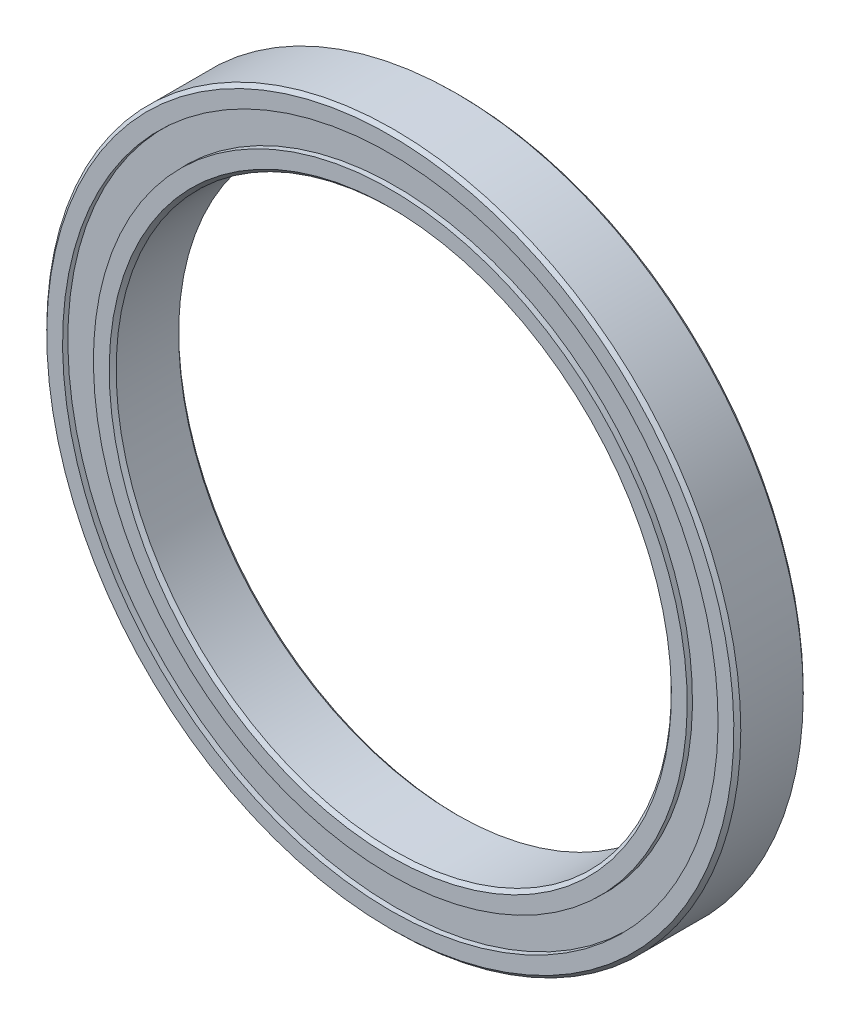
ISO-10303-21;
HEADER;
FILE_DESCRIPTION(('STEP AP214'),'2;1');
FILE_NAME('part.step','',(''),(''),'','','');
FILE_SCHEMA(('AUTOMOTIVE_DESIGN { 1 0 10303 214 1 1 1 1 }'));
ENDSEC;
DATA;
#1=APPLICATION_CONTEXT('core data for automotive mechanical design processes');
#2=APPLICATION_PROTOCOL_DEFINITION('international standard','automotive_design',2000,#1);
#3=PRODUCT_CONTEXT('',#1,'mechanical');
#4=PRODUCT('Part','Part','',(#3));
#5=PRODUCT_RELATED_PRODUCT_CATEGORY('part','',(#4));
#6=PRODUCT_DEFINITION_FORMATION('','',#4);
#7=PRODUCT_DEFINITION_CONTEXT('part definition',#1,'design');
#8=PRODUCT_DEFINITION('design','',#6,#7);
#9=PRODUCT_DEFINITION_SHAPE('','',#8);
#10=(LENGTH_UNIT() NAMED_UNIT(*) SI_UNIT(.MILLI.,.METRE.));
#11=(NAMED_UNIT(*) PLANE_ANGLE_UNIT() SI_UNIT($,.RADIAN.));
#12=(NAMED_UNIT(*) SI_UNIT($,.STERADIAN.) SOLID_ANGLE_UNIT());
#13=UNCERTAINTY_MEASURE_WITH_UNIT(LENGTH_MEASURE(1.E-05),#10,'distance_accuracy_value','');
#14=(GEOMETRIC_REPRESENTATION_CONTEXT(3) GLOBAL_UNCERTAINTY_ASSIGNED_CONTEXT((#13)) GLOBAL_UNIT_ASSIGNED_CONTEXT((#10,
#11,#12)) REPRESENTATION_CONTEXT('',''));
#15=CARTESIAN_POINT('',(0.,0.,0.));
#16=DIRECTION('',(0.,0.,1.));
#17=DIRECTION('',(1.,0.,0.));
#18=AXIS2_PLACEMENT_3D('',#15,#16,#17);
#19=CARTESIAN_POINT('',(10.3777141834092,43.7870191760922,0.));
#20=DIRECTION('',(0.,0.,1.));
#21=DIRECTION('',(0.230615870742427,0.973044870579827,0.));
#22=AXIS2_PLACEMENT_3D('',#19,#20,#21);
#23=SPHERICAL_SURFACE('',#22,3.14269680527354);
#24=CARTESIAN_POINT('',(10.3777141834092,43.7870191760922,3.14269680527354));
#25=VERTEX_POINT('',#24);
#26=VERTEX_LOOP('',#25);
#27=FACE_BOUND('',#26,.T.);
#28=ADVANCED_FACE('F44',(#27),#23,.T.);
#29=CLOSED_SHELL('',(#28));
#30=MANIFOLD_SOLID_BREP('B2',#29);
#31=CARTESIAN_POINT('',(20.1959631090203,40.2134688145538,0.));
#32=DIRECTION('',(0.,0.,1.));
#33=DIRECTION('',(0.448799180200451,0.893632640323418,0.));
#34=AXIS2_PLACEMENT_3D('',#31,#32,#33);
#35=SPHERICAL_SURFACE('',#34,3.14269680527354);
#36=CARTESIAN_POINT('',(20.1959631090203,40.2134688145538,3.14269680527354));
#37=VERTEX_POINT('',#36);
#38=VERTEX_LOOP('',#37);
#39=FACE_BOUND('',#38,.T.);
#40=ADVANCED_FACE('F65',(#39),#35,.T.);
#41=CLOSED_SHELL('',(#40));
#42=MANIFOLD_SOLID_BREP('B6',#41);
#43=CARTESIAN_POINT('',(28.9254424358938,34.4719999403544,0.));
#44=DIRECTION('',(0.,0.,1.));
#45=DIRECTION('',(0.642787609686529,0.766044443118986,0.));
#46=AXIS2_PLACEMENT_3D('',#43,#44,#45);
#47=SPHERICAL_SURFACE('',#46,3.14269680527354);
#48=CARTESIAN_POINT('',(28.9254424358938,34.4719999403544,3.14269680527354));
#49=VERTEX_POINT('',#48);
#50=VERTEX_LOOP('',#49);
#51=FACE_BOUND('',#50,.T.);
#52=ADVANCED_FACE('F86',(#51),#47,.T.);
#53=CLOSED_SHELL('',(#52));
#54=MANIFOLD_SOLID_BREP('B40',#53);
#55=CARTESIAN_POINT('',(36.0955436739766,26.8721366266258,0.));
#56=DIRECTION('',(0.,0.,1.));
#57=DIRECTION('',(0.802123192755037,0.597158591702796,0.));
#58=AXIS2_PLACEMENT_3D('',#55,#56,#57);
#59=SPHERICAL_SURFACE('',#58,3.14269680527354);
#60=CARTESIAN_POINT('',(36.0955436739766,26.8721366266258,3.14269680527354));
#61=VERTEX_POINT('',#60);
#62=VERTEX_LOOP('',#61);
#63=FACE_BOUND('',#62,.T.);
#64=ADVANCED_FACE('F107',(#63),#59,.T.);
#65=CLOSED_SHELL('',(#64));
#66=MANIFOLD_SOLID_BREP('B61',#65);
#67=CARTESIAN_POINT('',(41.3197248096121,17.8235894717625,0.));
#68=DIRECTION('',(0.,0.,1.));
#69=DIRECTION('',(0.91821610688027,0.396079766039167,0.));
#70=AXIS2_PLACEMENT_3D('',#67,#68,#69);
#71=SPHERICAL_SURFACE('',#70,3.14269680527354);
#72=CARTESIAN_POINT('',(41.3197248096121,17.8235894717625,3.14269680527354));
#73=VERTEX_POINT('',#72);
#74=VERTEX_LOOP('',#73);
#75=FACE_BOUND('',#74,.T.);
#76=ADVANCED_FACE('F128',(#75),#71,.T.);
#77=CLOSED_SHELL('',(#76));
#78=MANIFOLD_SOLID_BREP('B82',#77);
#79=CARTESIAN_POINT('',(44.3163488855493,7.81416799501236,0.));
#80=DIRECTION('',(0.,0.,1.));
#81=DIRECTION('',(0.984807753012206,0.173648177666941,0.));
#82=AXIS2_PLACEMENT_3D('',#79,#80,#81);
#83=SPHERICAL_SURFACE('',#82,3.14269680527354);
#84=CARTESIAN_POINT('',(44.3163488855493,7.81416799501236,3.14269680527354));
#85=VERTEX_POINT('',#84);
#86=VERTEX_LOOP('',#85);
#87=FACE_BOUND('',#86,.T.);
#88=ADVANCED_FACE('F149',(#87),#83,.T.);
#89=CLOSED_SHELL('',(#88));
#90=MANIFOLD_SOLID_BREP('B103',#89);
#91=CARTESIAN_POINT('',(44.9238671222071,-2.61651730097095,0.));
#92=DIRECTION('',(0.,0.,1.));
#93=DIRECTION('',(0.998308158271269,-0.0581448289104656,0.));
#94=AXIS2_PLACEMENT_3D('',#91,#92,#93);
#95=SPHERICAL_SURFACE('',#94,3.14269680527354);
#96=CARTESIAN_POINT('',(44.9238671222071,-2.61651730097095,3.14269680527354));
#97=VERTEX_POINT('',#96);
#98=VERTEX_LOOP('',#97);
#99=FACE_BOUND('',#98,.T.);
#100=ADVANCED_FACE('F170',(#99),#95,.T.);
#101=CLOSED_SHELL('',(#100));
#102=MANIFOLD_SOLID_BREP('B124',#101);
#103=CARTESIAN_POINT('',(43.1095280541971,-12.9061454719986,0.));
#104=DIRECTION('',(0.,0.,1.));
#105=DIRECTION('',(0.957989512315492,-0.28680323271108,0.));
#106=AXIS2_PLACEMENT_3D('',#103,#104,#105);
#107=SPHERICAL_SURFACE('',#106,3.14269680527354);
#108=CARTESIAN_POINT('',(43.1095280541971,-12.9061454719986,3.14269680527354));
#109=VERTEX_POINT('',#108);
#110=VERTEX_LOOP('',#109);
#111=FACE_BOUND('',#110,.T.);
#112=ADVANCED_FACE('F191',(#111),#107,.T.);
#113=CLOSED_SHELL('',(#112));
#114=MANIFOLD_SOLID_BREP('B145',#113);
#115=CARTESIAN_POINT('',(38.9711431702999,-22.4999999999996,0.));
#116=DIRECTION('',(0.,0.,1.));
#117=DIRECTION('',(0.866025403784443,-0.499999999999992,0.));
#118=AXIS2_PLACEMENT_3D('',#115,#116,#117);
#119=SPHERICAL_SURFACE('',#118,3.14269680527354);
#120=CARTESIAN_POINT('',(38.9711431702999,-22.4999999999996,3.14269680527353));
#121=VERTEX_POINT('',#120);
#122=VERTEX_LOOP('',#121);
#123=FACE_BOUND('',#122,.T.);
#124=ADVANCED_FACE('F212',(#123),#119,.T.);
#125=CLOSED_SHELL('',(#124));
#126=MANIFOLD_SOLID_BREP('B166',#125);
#127=CARTESIAN_POINT('',(32.7318138707875,-30.8808737040927,0.));
#128=DIRECTION('',(0.,0.,1.));
#129=DIRECTION('',(0.727373641573055,-0.686241637868727,0.));
#130=AXIS2_PLACEMENT_3D('',#127,#128,#129);
#131=SPHERICAL_SURFACE('',#130,3.14269680527354);
#132=CARTESIAN_POINT('',(32.7318138707875,-30.8808737040927,3.14269680527353));
#133=VERTEX_POINT('',#132);
#134=VERTEX_LOOP('',#133);
#135=FACE_BOUND('',#134,.T.);
#136=ADVANCED_FACE('F233',(#135),#131,.T.);
#137=CLOSED_SHELL('',(#136));
#138=MANIFOLD_SOLID_BREP('B187',#137);
#139=CARTESIAN_POINT('',(24.7279040131866,-37.5969515135819,0.));
#140=DIRECTION('',(0.,0.,1.));
#141=DIRECTION('',(0.549508978070813,-0.835487811412932,0.));
#142=AXIS2_PLACEMENT_3D('',#139,#140,#141);
#143=SPHERICAL_SURFACE('',#142,3.14269680527354);
#144=CARTESIAN_POINT('',(24.7279040131866,-37.5969515135819,3.14269680527353));
#145=VERTEX_POINT('',#144);
#146=VERTEX_LOOP('',#145);
#147=FACE_BOUND('',#146,.T.);
#148=ADVANCED_FACE('F256',(#147),#143,.T.);
#149=CLOSED_SHELL('',(#148));
#150=MANIFOLD_SOLID_BREP('B208',#149);
#151=CARTESIAN_POINT('',(15.3909064496554,-42.2861679353658,0.));
#152=DIRECTION('',(0.,0.,1.));
#153=DIRECTION('',(0.342020143325676,-0.939692620785906,0.));
#154=AXIS2_PLACEMENT_3D('',#151,#152,#153);
#155=SPHERICAL_SURFACE('',#154,3.14269680527354);
#156=CARTESIAN_POINT('',(15.3909064496554,-42.2861679353658,3.14269680527353));
#157=VERTEX_POINT('',#156);
#158=VERTEX_LOOP('',#157);
#159=FACE_BOUND('',#158,.T.);
#160=ADVANCED_FACE('F279',(#159),#155,.T.);
#161=CLOSED_SHELL('',(#160));
#162=MANIFOLD_SOLID_BREP('B229',#161);
#163=CARTESIAN_POINT('',(5.22418113563569,-44.6957260983874,0.));
#164=DIRECTION('',(0.,0.,1.));
#165=DIRECTION('',(0.116092914125238,-0.993238357741942,0.));
#166=AXIS2_PLACEMENT_3D('',#163,#164,#165);
#167=SPHERICAL_SURFACE('',#166,3.14269680527354);
#168=CARTESIAN_POINT('',(5.22418113563569,-44.6957260983874,3.14269680527353));
#169=VERTEX_POINT('',#168);
#170=VERTEX_LOOP('',#169);
#171=FACE_BOUND('',#170,.T.);
#172=ADVANCED_FACE('F302',(#171),#167,.T.);
#173=CLOSED_SHELL('',(#172));
#174=MANIFOLD_SOLID_BREP('B252',#173);
#175=CARTESIAN_POINT('',(-5.22418113563505,-44.6957260983875,0.));
#176=DIRECTION('',(0.,0.,1.));
#177=DIRECTION('',(-0.116092914125223,-0.993238357741944,0.));
#178=AXIS2_PLACEMENT_3D('',#175,#176,#177);
#179=SPHERICAL_SURFACE('',#178,3.14269680527354);
#180=CARTESIAN_POINT('',(-5.22418113563505,-44.6957260983875,3.14269680527353));
#181=VERTEX_POINT('',#180);
#182=VERTEX_LOOP('',#181);
#183=FACE_BOUND('',#182,.T.);
#184=ADVANCED_FACE('F325',(#183),#179,.T.);
#185=CLOSED_SHELL('',(#184));
#186=MANIFOLD_SOLID_BREP('B275',#185);
#187=CARTESIAN_POINT('',(-15.3909064496548,-42.286167935366,0.));
#188=DIRECTION('',(0.,0.,1.));
#189=DIRECTION('',(-0.342020143325663,-0.939692620785911,0.));
#190=AXIS2_PLACEMENT_3D('',#187,#188,#189);
#191=SPHERICAL_SURFACE('',#190,3.14269680527354);
#192=CARTESIAN_POINT('',(-15.3909064496548,-42.286167935366,3.14269680527353));
#193=VERTEX_POINT('',#192);
#194=VERTEX_LOOP('',#193);
#195=FACE_BOUND('',#194,.T.);
#196=ADVANCED_FACE('F348',(#195),#191,.T.);
#197=CLOSED_SHELL('',(#196));
#198=MANIFOLD_SOLID_BREP('B298',#197);
#199=CARTESIAN_POINT('',(-24.7279040131861,-37.5969515135823,0.));
#200=DIRECTION('',(0.,0.,1.));
#201=DIRECTION('',(-0.549508978070801,-0.835487811412939,0.));
#202=AXIS2_PLACEMENT_3D('',#199,#200,#201);
#203=SPHERICAL_SURFACE('',#202,3.14269680527354);
#204=CARTESIAN_POINT('',(-24.7279040131861,-37.5969515135823,3.14269680527353));
#205=VERTEX_POINT('',#204);
#206=VERTEX_LOOP('',#205);
#207=FACE_BOUND('',#206,.T.);
#208=ADVANCED_FACE('F371',(#207),#203,.T.);
#209=CLOSED_SHELL('',(#208));
#210=MANIFOLD_SOLID_BREP('B321',#209);
#211=CARTESIAN_POINT('',(-32.731813870787,-30.8808737040932,0.));
#212=DIRECTION('',(0.,0.,1.));
#213=DIRECTION('',(-0.727373641573045,-0.686241637868737,0.));
#214=AXIS2_PLACEMENT_3D('',#211,#212,#213);
#215=SPHERICAL_SURFACE('',#214,3.14269680527354);
#216=CARTESIAN_POINT('',(-32.731813870787,-30.8808737040932,3.14269680527353));
#217=VERTEX_POINT('',#216);
#218=VERTEX_LOOP('',#217);
#219=FACE_BOUND('',#218,.T.);
#220=ADVANCED_FACE('F394',(#219),#215,.T.);
#221=CLOSED_SHELL('',(#220));
#222=MANIFOLD_SOLID_BREP('B344',#221);
#223=CARTESIAN_POINT('',(-38.9711431702996,-22.5000000000002,0.));
#224=DIRECTION('',(0.,0.,1.));
#225=DIRECTION('',(-0.866025403784436,-0.500000000000004,0.));
#226=AXIS2_PLACEMENT_3D('',#223,#224,#225);
#227=SPHERICAL_SURFACE('',#226,3.14269680527354);
#228=CARTESIAN_POINT('',(-38.9711431702996,-22.5000000000002,3.14269680527353));
#229=VERTEX_POINT('',#228);
#230=VERTEX_LOOP('',#229);
#231=FACE_BOUND('',#230,.T.);
#232=ADVANCED_FACE('F417',(#231),#227,.T.);
#233=CLOSED_SHELL('',(#232));
#234=MANIFOLD_SOLID_BREP('B367',#233);
#235=CARTESIAN_POINT('',(-43.109528054197,-12.9061454719992,0.));
#236=DIRECTION('',(0.,0.,1.));
#237=DIRECTION('',(-0.957989512315488,-0.286803232711094,0.));
#238=AXIS2_PLACEMENT_3D('',#235,#236,#237);
#239=SPHERICAL_SURFACE('',#238,3.14269680527354);
#240=CARTESIAN_POINT('',(-43.109528054197,-12.9061454719992,3.14269680527354));
#241=VERTEX_POINT('',#240);
#242=VERTEX_LOOP('',#241);
#243=FACE_BOUND('',#242,.T.);
#244=ADVANCED_FACE('F440',(#243),#239,.T.);
#245=CLOSED_SHELL('',(#244));
#246=MANIFOLD_SOLID_BREP('B390',#245);
#247=CARTESIAN_POINT('',(-44.9238671222071,-2.61651730097158,0.));
#248=DIRECTION('',(0.,0.,1.));
#249=DIRECTION('',(-0.998308158271268,-0.0581448289104796,0.));
#250=AXIS2_PLACEMENT_3D('',#247,#248,#249);
#251=SPHERICAL_SURFACE('',#250,3.14269680527354);
#252=CARTESIAN_POINT('',(-44.9238671222071,-2.61651730097158,3.14269680527354));
#253=VERTEX_POINT('',#252);
#254=VERTEX_LOOP('',#253);
#255=FACE_BOUND('',#254,.T.);
#256=ADVANCED_FACE('F463',(#255),#251,.T.);
#257=CLOSED_SHELL('',(#256));
#258=MANIFOLD_SOLID_BREP('B413',#257);
#259=CARTESIAN_POINT('',(-44.3163488855494,7.81416799501172,0.));
#260=DIRECTION('',(0.,0.,1.));
#261=DIRECTION('',(-0.984807753012209,0.173648177666927,0.));
#262=AXIS2_PLACEMENT_3D('',#259,#260,#261);
#263=SPHERICAL_SURFACE('',#262,3.14269680527354);
#264=CARTESIAN_POINT('',(-44.3163488855494,7.81416799501172,3.14269680527354));
#265=VERTEX_POINT('',#264);
#266=VERTEX_LOOP('',#265);
#267=FACE_BOUND('',#266,.T.);
#268=ADVANCED_FACE('F486',(#267),#263,.T.);
#269=CLOSED_SHELL('',(#268));
#270=MANIFOLD_SOLID_BREP('B436',#269);
#271=CARTESIAN_POINT('',(-41.3197248096124,17.8235894717619,0.));
#272=DIRECTION('',(0.,0.,1.));
#273=DIRECTION('',(-0.918216106880275,0.396079766039154,0.));
#274=AXIS2_PLACEMENT_3D('',#271,#272,#273);
#275=SPHERICAL_SURFACE('',#274,3.14269680527354);
#276=CARTESIAN_POINT('',(-41.3197248096124,17.8235894717619,3.14269680527354));
#277=VERTEX_POINT('',#276);
#278=VERTEX_LOOP('',#277);
#279=FACE_BOUND('',#278,.T.);
#280=ADVANCED_FACE('F509',(#279),#275,.T.);
#281=CLOSED_SHELL('',(#280));
#282=MANIFOLD_SOLID_BREP('B459',#281);
#283=CARTESIAN_POINT('',(-36.095543673977,26.8721366266253,0.));
#284=DIRECTION('',(0.,0.,1.));
#285=DIRECTION('',(-0.802123192755045,0.597158591702785,0.));
#286=AXIS2_PLACEMENT_3D('',#283,#284,#285);
#287=SPHERICAL_SURFACE('',#286,3.14269680527354);
#288=CARTESIAN_POINT('',(-36.095543673977,26.8721366266253,3.14269680527354));
#289=VERTEX_POINT('',#288);
#290=VERTEX_LOOP('',#289);
#291=FACE_BOUND('',#290,.T.);
#292=ADVANCED_FACE('F532',(#291),#287,.T.);
#293=CLOSED_SHELL('',(#292));
#294=MANIFOLD_SOLID_BREP('B482',#293);
#295=CARTESIAN_POINT('',(-28.9254424358943,34.471999940354,0.));
#296=DIRECTION('',(0.,0.,1.));
#297=DIRECTION('',(-0.642787609686541,0.766044443118977,0.));
#298=AXIS2_PLACEMENT_3D('',#295,#296,#297);
#299=SPHERICAL_SURFACE('',#298,3.14269680527354);
#300=CARTESIAN_POINT('',(-28.9254424358943,34.471999940354,3.14269680527354));
#301=VERTEX_POINT('',#300);
#302=VERTEX_LOOP('',#301);
#303=FACE_BOUND('',#302,.T.);
#304=ADVANCED_FACE('F555',(#303),#299,.T.);
#305=CLOSED_SHELL('',(#304));
#306=MANIFOLD_SOLID_BREP('B505',#305);
#307=CARTESIAN_POINT('',(-20.1959631090208,40.2134688145535,0.));
#308=DIRECTION('',(0.,0.,1.));
#309=DIRECTION('',(-0.448799180200463,0.893632640323412,0.));
#310=AXIS2_PLACEMENT_3D('',#307,#308,#309);
#311=SPHERICAL_SURFACE('',#310,3.14269680527354);
#312=CARTESIAN_POINT('',(-20.1959631090208,40.2134688145535,3.14269680527354));
#313=VERTEX_POINT('',#312);
#314=VERTEX_LOOP('',#313);
#315=FACE_BOUND('',#314,.T.);
#316=ADVANCED_FACE('F578',(#315),#311,.T.);
#317=CLOSED_SHELL('',(#316));
#318=MANIFOLD_SOLID_BREP('B528',#317);
#319=CARTESIAN_POINT('',(-10.3777141834098,43.7870191760921,0.));
#320=DIRECTION('',(0.,0.,1.));
#321=DIRECTION('',(-0.230615870742441,0.973044870579824,0.));
#322=AXIS2_PLACEMENT_3D('',#319,#320,#321);
#323=SPHERICAL_SURFACE('',#322,3.14269680527354);
#324=CARTESIAN_POINT('',(-10.3777141834098,43.7870191760921,3.14269680527354));
#325=VERTEX_POINT('',#324);
#326=VERTEX_LOOP('',#325);
#327=FACE_BOUND('',#326,.T.);
#328=ADVANCED_FACE('F601',(#327),#323,.T.);
#329=CLOSED_SHELL('',(#328));
#330=MANIFOLD_SOLID_BREP('B551',#329);
#331=CARTESIAN_POINT('',(0.,45.,0.));
#332=DIRECTION('',(0.,0.,1.));
#333=DIRECTION('',(0.,1.,0.));
#334=AXIS2_PLACEMENT_3D('',#331,#332,#333);
#335=SPHERICAL_SURFACE('',#334,3.14269680527354);
#336=CARTESIAN_POINT('',(0.,45.,3.14269680527354));
#337=VERTEX_POINT('',#336);
#338=VERTEX_LOOP('',#337);
#339=FACE_BOUND('',#338,.T.);
#340=ADVANCED_FACE('F626',(#339),#335,.T.);
#341=CLOSED_SHELL('',(#340));
#342=MANIFOLD_SOLID_BREP('B574',#341);
#343=CARTESIAN_POINT('',(0.,42.7777777777778,5.00000000000003));
#344=DIRECTION('',(0.,0.,-1.));
#345=DIRECTION('',(0.,1.,0.));
#346=AXIS2_PLACEMENT_3D('',#343,#344,#345);
#347=PLANE('',#346);
#348=CARTESIAN_POINT('',(0.,0.,5.00000000000002));
#349=DIRECTION('',(0.,0.,1.));
#350=DIRECTION('',(0.,-1.,0.));
#351=AXIS2_PLACEMENT_3D('',#348,#349,#350);
#352=CIRCLE('',#351,40.5);
#353=CARTESIAN_POINT('',(0.,-40.5,5.00000000000002));
#354=VERTEX_POINT('',#353);
#355=EDGE_CURVE('E677',#354,#354,#352,.T.);
#356=ORIENTED_EDGE('',*,*,#355,.F.);
#357=EDGE_LOOP('',(#356));
#358=FACE_BOUND('',#357,.T.);
#359=CARTESIAN_POINT('',(0.,0.,5.00000000000002));
#360=DIRECTION('',(0.,0.,1.));
#361=DIRECTION('',(0.,-1.,0.));
#362=AXIS2_PLACEMENT_3D('',#359,#360,#361);
#363=CIRCLE('',#362,42.7777777777778);
#364=CARTESIAN_POINT('',(0.,-42.7777777777778,5.00000000000002));
#365=VERTEX_POINT('',#364);
#366=EDGE_CURVE('E625',#365,#365,#363,.T.);
#367=ORIENTED_EDGE('',*,*,#366,.T.);
#368=EDGE_LOOP('',(#367));
#369=FACE_BOUND('',#368,.T.);
#370=ADVANCED_FACE('F649',(#358,#369),#347,.F.);
#371=CARTESIAN_POINT('',(0.,0.,5.00000000000002));
#372=DIRECTION('',(0.,0.,1.));
#373=DIRECTION('',(0.,-1.,0.));
#374=AXIS2_PLACEMENT_3D('',#371,#372,#373);
#375=CYLINDRICAL_SURFACE('',#374,42.7777777777778);
#376=ORIENTED_EDGE('',*,*,#366,.F.);
#377=EDGE_LOOP('',(#376));
#378=FACE_BOUND('',#377,.T.);
#379=CARTESIAN_POINT('',(0.,0.,2.22222222222222));
#380=DIRECTION('',(0.,0.,1.));
#381=DIRECTION('',(0.,-1.,0.));
#382=AXIS2_PLACEMENT_3D('',#379,#380,#381);
#383=CIRCLE('',#382,42.7777777777778);
#384=CARTESIAN_POINT('',(0.,-42.7777777777778,2.22222222222221));
#385=VERTEX_POINT('',#384);
#386=EDGE_CURVE('E655',#385,#385,#383,.T.);
#387=ORIENTED_EDGE('',*,*,#386,.T.);
#388=EDGE_LOOP('',(#387));
#389=FACE_BOUND('',#388,.T.);
#390=ADVANCED_FACE('F684',(#378,#389),#375,.T.);
#391=CARTESIAN_POINT('',(0.,0.,0.));
#392=DIRECTION('',(0.,0.,1.));
#393=DIRECTION('',(0.,-1.,0.));
#394=AXIS2_PLACEMENT_3D('',#391,#392,#393);
#395=TOROIDAL_SURFACE('',#394,45.,3.14269680527354);
#396=ORIENTED_EDGE('',*,*,#386,.F.);
#397=EDGE_LOOP('',(#396));
#398=FACE_BOUND('',#397,.T.);
#399=CARTESIAN_POINT('',(0.,0.,-2.22222222222223));
#400=DIRECTION('',(0.,0.,1.));
#401=DIRECTION('',(0.,-1.,0.));
#402=AXIS2_PLACEMENT_3D('',#399,#400,#401);
#403=CIRCLE('',#402,42.7777777777778);
#404=CARTESIAN_POINT('',(0.,-42.7777777777778,-2.22222222222223));
#405=VERTEX_POINT('',#404);
#406=EDGE_CURVE('E659',#405,#405,#403,.T.);
#407=ORIENTED_EDGE('',*,*,#406,.T.);
#408=EDGE_LOOP('',(#407));
#409=FACE_BOUND('',#408,.T.);
#410=ADVANCED_FACE('F688',(#398,#409),#395,.F.);
#411=CARTESIAN_POINT('',(0.,0.,5.00000000000002));
#412=DIRECTION('',(0.,0.,1.));
#413=DIRECTION('',(0.,-1.,0.));
#414=AXIS2_PLACEMENT_3D('',#411,#412,#413);
#415=CYLINDRICAL_SURFACE('',#414,42.7777777777778);
#416=ORIENTED_EDGE('',*,*,#406,.F.);
#417=EDGE_LOOP('',(#416));
#418=FACE_BOUND('',#417,.T.);
#419=CARTESIAN_POINT('',(0.,0.,-5.00000000000003));
#420=DIRECTION('',(0.,0.,1.));
#421=DIRECTION('',(0.,-1.,0.));
#422=AXIS2_PLACEMENT_3D('',#419,#420,#421);
#423=CIRCLE('',#422,42.7777777777778);
#424=CARTESIAN_POINT('',(0.,-42.7777777777778,-5.00000000000004));
#425=VERTEX_POINT('',#424);
#426=EDGE_CURVE('E663',#425,#425,#423,.T.);
#427=ORIENTED_EDGE('',*,*,#426,.T.);
#428=EDGE_LOOP('',(#427));
#429=FACE_BOUND('',#428,.T.);
#430=ADVANCED_FACE('F693',(#418,#429),#415,.T.);
#431=CARTESIAN_POINT('',(0.,40.5,-5.00000000000003));
#432=DIRECTION('',(0.,0.,1.));
#433=DIRECTION('',(0.,-1.,0.));
#434=AXIS2_PLACEMENT_3D('',#431,#432,#433);
#435=PLANE('',#434);
#436=ORIENTED_EDGE('',*,*,#426,.F.);
#437=EDGE_LOOP('',(#436));
#438=FACE_BOUND('',#437,.T.);
#439=CARTESIAN_POINT('',(0.,0.,-5.00000000000003));
#440=DIRECTION('',(0.,0.,1.));
#441=DIRECTION('',(0.,-1.,0.));
#442=AXIS2_PLACEMENT_3D('',#439,#440,#441);
#443=CIRCLE('',#442,40.5);
#444=CARTESIAN_POINT('',(0.,-40.5,-5.00000000000004));
#445=VERTEX_POINT('',#444);
#446=EDGE_CURVE('E668',#445,#445,#443,.T.);
#447=ORIENTED_EDGE('',*,*,#446,.T.);
#448=EDGE_LOOP('',(#447));
#449=FACE_BOUND('',#448,.T.);
#450=ADVANCED_FACE('F699',(#438,#449),#435,.F.);
#451=CARTESIAN_POINT('',(0.,0.,-4.50000000000002));
#452=DIRECTION('',(0.,0.,-1.));
#453=DIRECTION('',(0.,1.,0.));
#454=AXIS2_PLACEMENT_3D('',#451,#452,#453);
#455=CONICAL_SURFACE('',#454,40.,0.785398163397417);
#456=ORIENTED_EDGE('',*,*,#446,.F.);
#457=EDGE_LOOP('',(#456));
#458=FACE_BOUND('',#457,.T.);
#459=CARTESIAN_POINT('',(0.,0.,-4.50000000000002));
#460=DIRECTION('',(0.,0.,1.));
#461=DIRECTION('',(0.,-1.,0.));
#462=AXIS2_PLACEMENT_3D('',#459,#460,#461);
#463=CIRCLE('',#462,40.);
#464=CARTESIAN_POINT('',(0.,-40.,-4.50000000000003));
#465=VERTEX_POINT('',#464);
#466=EDGE_CURVE('E671',#465,#465,#463,.T.);
#467=ORIENTED_EDGE('',*,*,#466,.T.);
#468=EDGE_LOOP('',(#467));
#469=FACE_BOUND('',#468,.T.);
#470=ADVANCED_FACE('F703',(#458,#469),#455,.F.);
#471=CARTESIAN_POINT('',(0.,0.,5.00000000000002));
#472=DIRECTION('',(0.,0.,1.));
#473=DIRECTION('',(0.,-1.,0.));
#474=AXIS2_PLACEMENT_3D('',#471,#472,#473);
#475=CYLINDRICAL_SURFACE('',#474,40.);
#476=ORIENTED_EDGE('',*,*,#466,.F.);
#477=EDGE_LOOP('',(#476));
#478=FACE_BOUND('',#477,.T.);
#479=CARTESIAN_POINT('',(0.,0.,4.50000000000004));
#480=DIRECTION('',(0.,0.,1.));
#481=DIRECTION('',(0.,-1.,0.));
#482=AXIS2_PLACEMENT_3D('',#479,#480,#481);
#483=CIRCLE('',#482,40.);
#484=CARTESIAN_POINT('',(0.,-40.,4.50000000000004));
#485=VERTEX_POINT('',#484);
#486=EDGE_CURVE('E674',#485,#485,#483,.T.);
#487=ORIENTED_EDGE('',*,*,#486,.T.);
#488=EDGE_LOOP('',(#487));
#489=FACE_BOUND('',#488,.T.);
#490=ADVANCED_FACE('F707',(#478,#489),#475,.F.);
#491=CARTESIAN_POINT('',(0.,0.,5.00000000000002));
#492=DIRECTION('',(0.,0.,1.));
#493=DIRECTION('',(0.,-1.,0.));
#494=AXIS2_PLACEMENT_3D('',#491,#492,#493);
#495=CONICAL_SURFACE('',#494,40.5,0.785398163397481);
#496=ORIENTED_EDGE('',*,*,#486,.F.);
#497=EDGE_LOOP('',(#496));
#498=FACE_BOUND('',#497,.T.);
#499=ORIENTED_EDGE('',*,*,#355,.T.);
#500=EDGE_LOOP('',(#499));
#501=FACE_BOUND('',#500,.T.);
#502=ADVANCED_FACE('F681',(#498,#501),#495,.F.);
#503=CLOSED_SHELL('',(#370,#390,#410,#430,#450,#470,#490,#502));
#504=MANIFOLD_SOLID_BREP('B597',#503);
#505=CARTESIAN_POINT('',(0.,42.8031777777778,-3.88084840263679));
#506=DIRECTION('',(0.,0.,-1.));
#507=DIRECTION('',(0.,1.,0.));
#508=AXIS2_PLACEMENT_3D('',#505,#506,#507);
#509=PLANE('',#508);
#510=CARTESIAN_POINT('',(0.,0.,-3.88084840263679));
#511=DIRECTION('',(0.,0.,1.));
#512=DIRECTION('',(0.,-1.,0.));
#513=AXIS2_PLACEMENT_3D('',#510,#511,#512);
#514=CIRCLE('',#513,42.8031777777778);
#515=CARTESIAN_POINT('',(0.,-42.8031777777778,-3.88084840263679));
#516=VERTEX_POINT('',#515);
#517=EDGE_CURVE('E795',#516,#516,#514,.T.);
#518=ORIENTED_EDGE('',*,*,#517,.F.);
#519=EDGE_LOOP('',(#518));
#520=FACE_BOUND('',#519,.T.);
#521=CARTESIAN_POINT('',(0.,0.,-3.88084840263679));
#522=DIRECTION('',(0.,0.,1.));
#523=DIRECTION('',(0.,-1.,0.));
#524=AXIS2_PLACEMENT_3D('',#521,#522,#523);
#525=CIRCLE('',#524,47.1968222222222);
#526=CARTESIAN_POINT('',(0.,-47.1968222222222,-3.8808484026368));
#527=VERTEX_POINT('',#526);
#528=EDGE_CURVE('E648',#527,#527,#525,.T.);
#529=ORIENTED_EDGE('',*,*,#528,.T.);
#530=EDGE_LOOP('',(#529));
#531=FACE_BOUND('',#530,.T.);
#532=ADVANCED_FACE('F781',(#520,#531),#509,.F.);
#533=CARTESIAN_POINT('',(0.,0.,5.00000000000002));
#534=DIRECTION('',(0.,0.,1.));
#535=DIRECTION('',(0.,-1.,0.));
#536=AXIS2_PLACEMENT_3D('',#533,#534,#535);
#537=CYLINDRICAL_SURFACE('',#536,47.1968222222222);
#538=ORIENTED_EDGE('',*,*,#528,.F.);
#539=EDGE_LOOP('',(#538));
#540=FACE_BOUND('',#539,.T.);
#541=CARTESIAN_POINT('',(0.,0.,-4.26184840263679));
#542=DIRECTION('',(0.,0.,1.));
#543=DIRECTION('',(0.,-1.,0.));
#544=AXIS2_PLACEMENT_3D('',#541,#542,#543);
#545=CIRCLE('',#544,47.1968222222222);
#546=CARTESIAN_POINT('',(0.,-47.1968222222222,-4.26184840263679));
#547=VERTEX_POINT('',#546);
#548=EDGE_CURVE('E787',#547,#547,#545,.T.);
#549=ORIENTED_EDGE('',*,*,#548,.T.);
#550=EDGE_LOOP('',(#549));
#551=FACE_BOUND('',#550,.T.);
#552=ADVANCED_FACE('F804',(#540,#551),#537,.T.);
#553=CARTESIAN_POINT('',(0.,42.8031777777778,-4.26184840263678));
#554=DIRECTION('',(0.,0.,1.));
#555=DIRECTION('',(0.,-1.,0.));
#556=AXIS2_PLACEMENT_3D('',#553,#554,#555);
#557=PLANE('',#556);
#558=ORIENTED_EDGE('',*,*,#548,.F.);
#559=EDGE_LOOP('',(#558));
#560=FACE_BOUND('',#559,.T.);
#561=CARTESIAN_POINT('',(0.,0.,-4.26184840263679));
#562=DIRECTION('',(0.,0.,1.));
#563=DIRECTION('',(0.,-1.,0.));
#564=AXIS2_PLACEMENT_3D('',#561,#562,#563);
#565=CIRCLE('',#564,42.8031777777778);
#566=CARTESIAN_POINT('',(0.,-42.8031777777778,-4.2618484026368));
#567=VERTEX_POINT('',#566);
#568=EDGE_CURVE('E791',#567,#567,#565,.T.);
#569=ORIENTED_EDGE('',*,*,#568,.T.);
#570=EDGE_LOOP('',(#569));
#571=FACE_BOUND('',#570,.T.);
#572=ADVANCED_FACE('F808',(#560,#571),#557,.F.);
#573=CARTESIAN_POINT('',(0.,0.,5.00000000000002));
#574=DIRECTION('',(0.,0.,1.));
#575=DIRECTION('',(0.,-1.,0.));
#576=AXIS2_PLACEMENT_3D('',#573,#574,#575);
#577=CYLINDRICAL_SURFACE('',#576,42.8031777777778);
#578=ORIENTED_EDGE('',*,*,#568,.F.);
#579=EDGE_LOOP('',(#578));
#580=FACE_BOUND('',#579,.T.);
#581=ORIENTED_EDGE('',*,*,#517,.T.);
#582=EDGE_LOOP('',(#581));
#583=FACE_BOUND('',#582,.T.);
#584=ADVANCED_FACE('F801',(#580,#583),#577,.F.);
#585=CLOSED_SHELL('',(#532,#552,#572,#584));
#586=MANIFOLD_SOLID_BREP('B620',#585);
#587=CARTESIAN_POINT('',(0.,42.8031777777778,4.26184840263678));
#588=DIRECTION('',(0.,0.,-1.));
#589=DIRECTION('',(0.,1.,0.));
#590=AXIS2_PLACEMENT_3D('',#587,#588,#589);
#591=PLANE('',#590);
#592=CARTESIAN_POINT('',(0.,0.,4.26184840263678));
#593=DIRECTION('',(0.,0.,1.));
#594=DIRECTION('',(0.,-1.,0.));
#595=AXIS2_PLACEMENT_3D('',#592,#593,#594);
#596=CIRCLE('',#595,42.8031777777778);
#597=CARTESIAN_POINT('',(0.,-42.8031777777778,4.26184840263677));
#598=VERTEX_POINT('',#597);
#599=EDGE_CURVE('E780',#598,#598,#596,.T.);
#600=ORIENTED_EDGE('',*,*,#599,.F.);
#601=EDGE_LOOP('',(#600));
#602=FACE_BOUND('',#601,.T.);
#603=CARTESIAN_POINT('',(0.,0.,4.26184840263678));
#604=DIRECTION('',(0.,0.,1.));
#605=DIRECTION('',(0.,-1.,0.));
#606=AXIS2_PLACEMENT_3D('',#603,#604,#605);
#607=CIRCLE('',#606,47.1968222222222);
#608=CARTESIAN_POINT('',(0.,-47.1968222222222,4.26184840263677));
#609=VERTEX_POINT('',#608);
#610=EDGE_CURVE('E866',#609,#609,#607,.T.);
#611=ORIENTED_EDGE('',*,*,#610,.T.);
#612=EDGE_LOOP('',(#611));
#613=FACE_BOUND('',#612,.T.);
#614=ADVANCED_FACE('F852',(#602,#613),#591,.F.);
#615=CARTESIAN_POINT('',(0.,0.,5.00000000000002));
#616=DIRECTION('',(0.,0.,1.));
#617=DIRECTION('',(0.,-1.,0.));
#618=AXIS2_PLACEMENT_3D('',#615,#616,#617);
#619=CYLINDRICAL_SURFACE('',#618,42.8031777777778);
#620=CARTESIAN_POINT('',(0.,0.,3.88084840263678));
#621=DIRECTION('',(0.,0.,1.));
#622=DIRECTION('',(0.,-1.,0.));
#623=AXIS2_PLACEMENT_3D('',#620,#621,#622);
#624=CIRCLE('',#623,42.8031777777778);
#625=CARTESIAN_POINT('',(0.,-42.8031777777778,3.88084840263677));
#626=VERTEX_POINT('',#625);
#627=EDGE_CURVE('E858',#626,#626,#624,.T.);
#628=ORIENTED_EDGE('',*,*,#627,.F.);
#629=EDGE_LOOP('',(#628));
#630=FACE_BOUND('',#629,.T.);
#631=ORIENTED_EDGE('',*,*,#599,.T.);
#632=EDGE_LOOP('',(#631));
#633=FACE_BOUND('',#632,.T.);
#634=ADVANCED_FACE('F881',(#630,#633),#619,.F.);
#635=CARTESIAN_POINT('',(0.,42.8031777777778,3.88084840263678));
#636=DIRECTION('',(0.,0.,1.));
#637=DIRECTION('',(0.,-1.,0.));
#638=AXIS2_PLACEMENT_3D('',#635,#636,#637);
#639=PLANE('',#638);
#640=CARTESIAN_POINT('',(0.,0.,3.88084840263678));
#641=DIRECTION('',(0.,0.,1.));
#642=DIRECTION('',(0.,-1.,0.));
#643=AXIS2_PLACEMENT_3D('',#640,#641,#642);
#644=CIRCLE('',#643,47.1968222222222);
#645=CARTESIAN_POINT('',(0.,-47.1968222222222,3.88084840263677));
#646=VERTEX_POINT('',#645);
#647=EDGE_CURVE('E862',#646,#646,#644,.T.);
#648=ORIENTED_EDGE('',*,*,#647,.F.);
#649=EDGE_LOOP('',(#648));
#650=FACE_BOUND('',#649,.T.);
#651=ORIENTED_EDGE('',*,*,#627,.T.);
#652=EDGE_LOOP('',(#651));
#653=FACE_BOUND('',#652,.T.);
#654=ADVANCED_FACE('F876',(#650,#653),#639,.F.);
#655=CARTESIAN_POINT('',(0.,0.,5.00000000000002));
#656=DIRECTION('',(0.,0.,1.));
#657=DIRECTION('',(0.,-1.,0.));
#658=AXIS2_PLACEMENT_3D('',#655,#656,#657);
#659=CYLINDRICAL_SURFACE('',#658,47.1968222222222);
#660=ORIENTED_EDGE('',*,*,#610,.F.);
#661=EDGE_LOOP('',(#660));
#662=FACE_BOUND('',#661,.T.);
#663=ORIENTED_EDGE('',*,*,#647,.T.);
#664=EDGE_LOOP('',(#663));
#665=FACE_BOUND('',#664,.T.);
#666=ADVANCED_FACE('F873',(#662,#665),#659,.T.);
#667=CLOSED_SHELL('',(#614,#634,#654,#666));
#668=MANIFOLD_SOLID_BREP('B643',#667);
#669=CARTESIAN_POINT('',(0.,0.,4.50000000000001));
#670=DIRECTION('',(0.,0.,-1.));
#671=DIRECTION('',(0.,1.,0.));
#672=AXIS2_PLACEMENT_3D('',#669,#670,#671);
#673=CONICAL_SURFACE('',#672,50.,0.785398163397442);
#674=CARTESIAN_POINT('',(0.,0.,5.00000000000001));
#675=DIRECTION('',(0.,0.,1.));
#676=DIRECTION('',(0.,-1.,0.));
#677=AXIS2_PLACEMENT_3D('',#674,#675,#676);
#678=CIRCLE('',#677,49.5);
#679=CARTESIAN_POINT('',(0.,-49.5,5.));
#680=VERTEX_POINT('',#679);
#681=EDGE_CURVE('E944',#680,#680,#678,.T.);
#682=ORIENTED_EDGE('',*,*,#681,.F.);
#683=EDGE_LOOP('',(#682));
#684=FACE_BOUND('',#683,.T.);
#685=CARTESIAN_POINT('',(0.,0.,4.50000000000001));
#686=DIRECTION('',(0.,0.,1.));
#687=DIRECTION('',(0.,-1.,0.));
#688=AXIS2_PLACEMENT_3D('',#685,#686,#687);
#689=CIRCLE('',#688,50.);
#690=CARTESIAN_POINT('',(0.,-50.,4.5));
#691=VERTEX_POINT('',#690);
#692=EDGE_CURVE('E851',#691,#691,#689,.T.);
#693=ORIENTED_EDGE('',*,*,#692,.T.);
#694=EDGE_LOOP('',(#693));
#695=FACE_BOUND('',#694,.T.);
#696=ADVANCED_FACE('F916',(#684,#695),#673,.T.);
#697=CARTESIAN_POINT('',(0.,0.,5.00000000000002));
#698=DIRECTION('',(0.,0.,1.));
#699=DIRECTION('',(0.,-1.,0.));
#700=AXIS2_PLACEMENT_3D('',#697,#698,#699);
#701=CYLINDRICAL_SURFACE('',#700,50.);
#702=ORIENTED_EDGE('',*,*,#692,.F.);
#703=EDGE_LOOP('',(#702));
#704=FACE_BOUND('',#703,.T.);
#705=CARTESIAN_POINT('',(0.,0.,-4.50000000000002));
#706=DIRECTION('',(0.,0.,1.));
#707=DIRECTION('',(0.,-1.,0.));
#708=AXIS2_PLACEMENT_3D('',#705,#706,#707);
#709=CIRCLE('',#708,50.);
#710=CARTESIAN_POINT('',(0.,-50.,-4.50000000000003));
#711=VERTEX_POINT('',#710);
#712=EDGE_CURVE('E922',#711,#711,#709,.T.);
#713=ORIENTED_EDGE('',*,*,#712,.T.);
#714=EDGE_LOOP('',(#713));
#715=FACE_BOUND('',#714,.T.);
#716=ADVANCED_FACE('F951',(#704,#715),#701,.T.);
#717=CARTESIAN_POINT('',(0.,0.,-5.00000000000002));
#718=DIRECTION('',(0.,0.,1.));
#719=DIRECTION('',(0.,-1.,0.));
#720=AXIS2_PLACEMENT_3D('',#717,#718,#719);
#721=CONICAL_SURFACE('',#720,49.5,0.785398163397443);
#722=ORIENTED_EDGE('',*,*,#712,.F.);
#723=EDGE_LOOP('',(#722));
#724=FACE_BOUND('',#723,.T.);
#725=CARTESIAN_POINT('',(0.,0.,-5.00000000000002));
#726=DIRECTION('',(0.,0.,1.));
#727=DIRECTION('',(0.,-1.,0.));
#728=AXIS2_PLACEMENT_3D('',#725,#726,#727);
#729=CIRCLE('',#728,49.5);
#730=CARTESIAN_POINT('',(0.,-49.5,-5.00000000000003));
#731=VERTEX_POINT('',#730);
#732=EDGE_CURVE('E926',#731,#731,#729,.T.);
#733=ORIENTED_EDGE('',*,*,#732,.T.);
#734=EDGE_LOOP('',(#733));
#735=FACE_BOUND('',#734,.T.);
#736=ADVANCED_FACE('F955',(#724,#735),#721,.T.);
#737=CARTESIAN_POINT('',(0.,49.5,-5.00000000000002));
#738=DIRECTION('',(0.,0.,1.));
#739=DIRECTION('',(0.,-1.,0.));
#740=AXIS2_PLACEMENT_3D('',#737,#738,#739);
#741=PLANE('',#740);
#742=ORIENTED_EDGE('',*,*,#732,.F.);
#743=EDGE_LOOP('',(#742));
#744=FACE_BOUND('',#743,.T.);
#745=CARTESIAN_POINT('',(0.,0.,-5.00000000000003));
#746=DIRECTION('',(0.,0.,1.));
#747=DIRECTION('',(0.,-1.,0.));
#748=AXIS2_PLACEMENT_3D('',#745,#746,#747);
#749=CIRCLE('',#748,47.2222222222222);
#750=CARTESIAN_POINT('',(0.,-47.2222222222222,-5.00000000000003));
#751=VERTEX_POINT('',#750);
#752=EDGE_CURVE('E930',#751,#751,#749,.T.);
#753=ORIENTED_EDGE('',*,*,#752,.T.);
#754=EDGE_LOOP('',(#753));
#755=FACE_BOUND('',#754,.T.);
#756=ADVANCED_FACE('F960',(#744,#755),#741,.F.);
#757=CARTESIAN_POINT('',(0.,0.,5.00000000000002));
#758=DIRECTION('',(0.,0.,1.));
#759=DIRECTION('',(0.,-1.,0.));
#760=AXIS2_PLACEMENT_3D('',#757,#758,#759);
#761=CYLINDRICAL_SURFACE('',#760,47.2222222222222);
#762=ORIENTED_EDGE('',*,*,#752,.F.);
#763=EDGE_LOOP('',(#762));
#764=FACE_BOUND('',#763,.T.);
#765=CARTESIAN_POINT('',(0.,0.,-2.22222222222223));
#766=DIRECTION('',(0.,0.,1.));
#767=DIRECTION('',(0.,-1.,0.));
#768=AXIS2_PLACEMENT_3D('',#765,#766,#767);
#769=CIRCLE('',#768,47.2222222222222);
#770=CARTESIAN_POINT('',(0.,-47.2222222222222,-2.22222222222224));
#771=VERTEX_POINT('',#770);
#772=EDGE_CURVE('E935',#771,#771,#769,.T.);
#773=ORIENTED_EDGE('',*,*,#772,.T.);
#774=EDGE_LOOP('',(#773));
#775=FACE_BOUND('',#774,.T.);
#776=ADVANCED_FACE('F966',(#764,#775),#761,.F.);
#777=CARTESIAN_POINT('',(0.,0.,0.));
#778=DIRECTION('',(0.,0.,1.));
#779=DIRECTION('',(0.,-1.,0.));
#780=AXIS2_PLACEMENT_3D('',#777,#778,#779);
#781=TOROIDAL_SURFACE('',#780,45.,3.14269680527354);
#782=ORIENTED_EDGE('',*,*,#772,.F.);
#783=EDGE_LOOP('',(#782));
#784=FACE_BOUND('',#783,.T.);
#785=CARTESIAN_POINT('',(0.,0.,2.22222222222221));
#786=DIRECTION('',(0.,0.,1.));
#787=DIRECTION('',(0.,-1.,0.));
#788=AXIS2_PLACEMENT_3D('',#785,#786,#787);
#789=CIRCLE('',#788,47.2222222222222);
#790=CARTESIAN_POINT('',(0.,-47.2222222222222,2.22222222222221));
#791=VERTEX_POINT('',#790);
#792=EDGE_CURVE('E938',#791,#791,#789,.T.);
#793=ORIENTED_EDGE('',*,*,#792,.T.);
#794=EDGE_LOOP('',(#793));
#795=FACE_BOUND('',#794,.T.);
#796=ADVANCED_FACE('F970',(#784,#795),#781,.F.);
#797=CARTESIAN_POINT('',(0.,0.,5.00000000000002));
#798=DIRECTION('',(0.,0.,1.));
#799=DIRECTION('',(0.,-1.,0.));
#800=AXIS2_PLACEMENT_3D('',#797,#798,#799);
#801=CYLINDRICAL_SURFACE('',#800,47.2222222222222);
#802=ORIENTED_EDGE('',*,*,#792,.F.);
#803=EDGE_LOOP('',(#802));
#804=FACE_BOUND('',#803,.T.);
#805=CARTESIAN_POINT('',(0.,0.,5.00000000000001));
#806=DIRECTION('',(0.,0.,1.));
#807=DIRECTION('',(0.,-1.,0.));
#808=AXIS2_PLACEMENT_3D('',#805,#806,#807);
#809=CIRCLE('',#808,47.2222222222222);
#810=CARTESIAN_POINT('',(0.,-47.2222222222222,5.00000000000001));
#811=VERTEX_POINT('',#810);
#812=EDGE_CURVE('E941',#811,#811,#809,.T.);
#813=ORIENTED_EDGE('',*,*,#812,.T.);
#814=EDGE_LOOP('',(#813));
#815=FACE_BOUND('',#814,.T.);
#816=ADVANCED_FACE('F974',(#804,#815),#801,.F.);
#817=CARTESIAN_POINT('',(0.,49.5,5.00000000000002));
#818=DIRECTION('',(0.,0.,-1.));
#819=DIRECTION('',(0.,1.,0.));
#820=AXIS2_PLACEMENT_3D('',#817,#818,#819);
#821=PLANE('',#820);
#822=ORIENTED_EDGE('',*,*,#812,.F.);
#823=EDGE_LOOP('',(#822));
#824=FACE_BOUND('',#823,.T.);
#825=ORIENTED_EDGE('',*,*,#681,.T.);
#826=EDGE_LOOP('',(#825));
#827=FACE_BOUND('',#826,.T.);
#828=ADVANCED_FACE('F948',(#824,#827),#821,.F.);
#829=CLOSED_SHELL('',(#696,#716,#736,#756,#776,#796,#816,#828));
#830=MANIFOLD_SOLID_BREP('B775',#829);
#831=ADVANCED_BREP_SHAPE_REPRESENTATION('',(#18,#30,#42,#54,#66,#78,#90,#102,#114,#126,#138,
#150,#162,#174,#186,#198,#210,#222,#234,#246,#258,#270,#282,#294,#306,#318,#330,#342,#504,#586,
#668,#830),#14);
#832=SHAPE_DEFINITION_REPRESENTATION(#9,#831);
ENDSEC;
END-ISO-10303-21;
